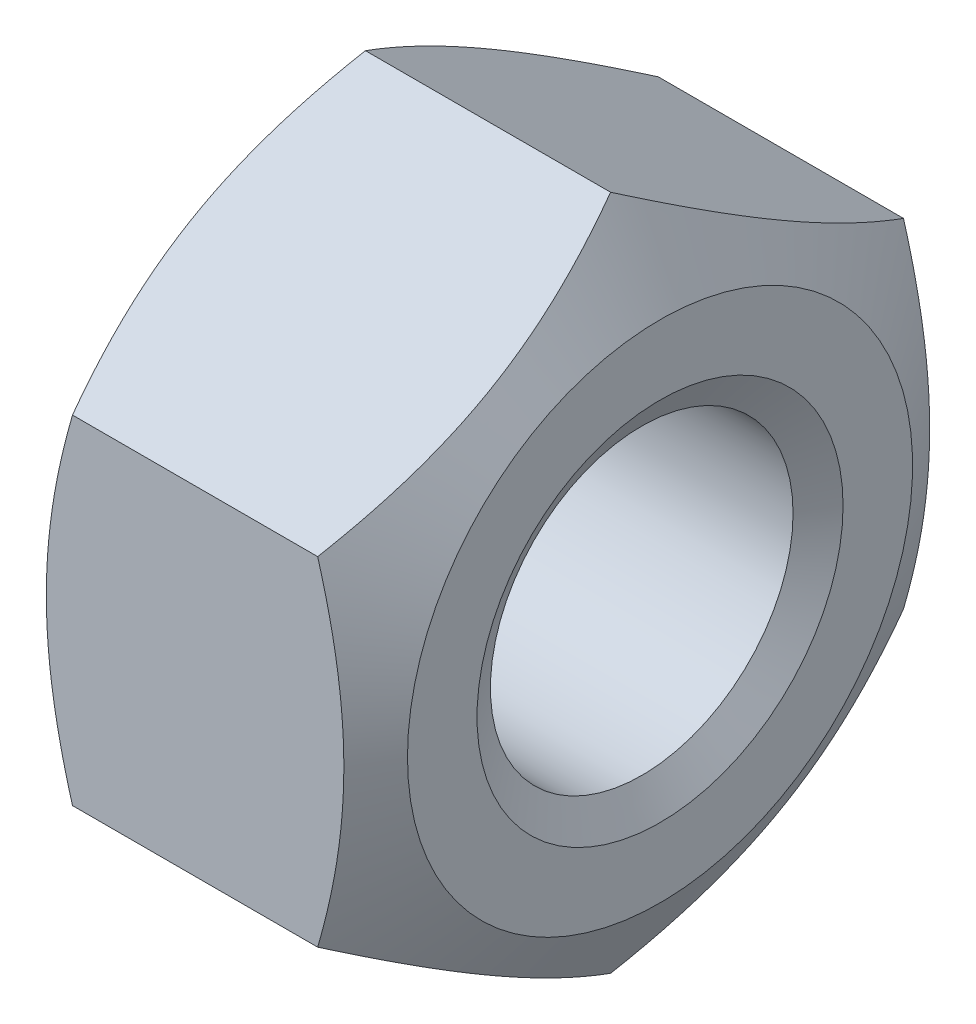
ISO-10303-21;
HEADER;
FILE_DESCRIPTION(('STEP AP214'),'2;1');
FILE_NAME('part.step','',(''),(''),'','','');
FILE_SCHEMA(('AUTOMOTIVE_DESIGN { 1 0 10303 214 1 1 1 1 }'));
ENDSEC;
DATA;
#1=APPLICATION_CONTEXT('core data for automotive mechanical design processes');
#2=APPLICATION_PROTOCOL_DEFINITION('international standard','automotive_design',2000,#1);
#3=PRODUCT_CONTEXT('',#1,'mechanical');
#4=PRODUCT('Part','Part','',(#3));
#5=PRODUCT_RELATED_PRODUCT_CATEGORY('part','',(#4));
#6=PRODUCT_DEFINITION_FORMATION('','',#4);
#7=PRODUCT_DEFINITION_CONTEXT('part definition',#1,'design');
#8=PRODUCT_DEFINITION('design','',#6,#7);
#9=PRODUCT_DEFINITION_SHAPE('','',#8);
#10=(LENGTH_UNIT() NAMED_UNIT(*) SI_UNIT(.MILLI.,.METRE.));
#11=(NAMED_UNIT(*) PLANE_ANGLE_UNIT() SI_UNIT($,.RADIAN.));
#12=(NAMED_UNIT(*) SI_UNIT($,.STERADIAN.) SOLID_ANGLE_UNIT());
#13=UNCERTAINTY_MEASURE_WITH_UNIT(LENGTH_MEASURE(1.E-05),#10,'distance_accuracy_value','');
#14=(GEOMETRIC_REPRESENTATION_CONTEXT(3) GLOBAL_UNCERTAINTY_ASSIGNED_CONTEXT((#13)) GLOBAL_UNIT_ASSIGNED_CONTEXT((#10,
#11,#12)) REPRESENTATION_CONTEXT('',''));
#15=CARTESIAN_POINT('',(0.,0.,0.));
#16=DIRECTION('',(0.,0.,1.));
#17=DIRECTION('',(1.,0.,0.));
#18=AXIS2_PLACEMENT_3D('',#15,#16,#17);
#19=CARTESIAN_POINT('',(0.,0.,-2.75849364905392));
#20=DIRECTION('',(-1.,0.,0.));
#21=DIRECTION('',(0.,0.,1.));
#22=AXIS2_PLACEMENT_3D('',#19,#20,#21);
#23=PLANE('',#22);
#24=CARTESIAN_POINT('',(-3.41060513164848E-10,0.,0.));
#25=DIRECTION('',(-1.,0.,0.));
#26=DIRECTION('',(0.,0.,1.));
#27=AXIS2_PLACEMENT_3D('',#24,#25,#26);
#28=CIRCLE('',#27,2.49999999988404);
#29=CARTESIAN_POINT('',(-3.41060513164848E-10,0.,2.49999999988404));
#30=VERTEX_POINT('',#29);
#31=EDGE_CURVE('E79',#30,#30,#28,.F.);
#32=ORIENTED_EDGE('',*,*,#31,.T.);
#33=EDGE_LOOP('',(#32));
#34=FACE_BOUND('',#33,.T.);
#35=CARTESIAN_POINT('',(-6.97352332129642E-10,0.,0.));
#36=DIRECTION('',(1.,0.,0.));
#37=DIRECTION('',(0.,0.,-1.));
#38=AXIS2_PLACEMENT_3D('',#35,#36,#37);
#39=CIRCLE('',#38,3.45000000044138);
#40=CARTESIAN_POINT('',(-6.97352332129642E-10,0.,-3.45000000044138));
#41=VERTEX_POINT('',#40);
#42=EDGE_CURVE('E20',#41,#41,#39,.T.);
#43=ORIENTED_EDGE('',*,*,#42,.F.);
#44=EDGE_LOOP('',(#43));
#45=FACE_BOUND('',#44,.T.);
#46=ADVANCED_FACE('F16',(#34,#45),#23,.T.);
#47=CARTESIAN_POINT('',(0.679552814517592,0.,0.));
#48=DIRECTION('',(1.,0.,0.));
#49=DIRECTION('',(0.,0.,-1.));
#50=AXIS2_PLACEMENT_3D('',#47,#48,#49);
#51=CONICAL_SURFACE('',#50,4.62701999953197,1.04719754998692);
#52=ORIENTED_EDGE('',*,*,#42,.T.);
#53=EDGE_LOOP('',(#52));
#54=FACE_BOUND('',#53,.T.);
#55=CARTESIAN_POINT('',(0.675499815710433,2.31000000025916,-4.00103736538083));
#56=CARTESIAN_POINT('',(0.616875706146725,2.41151051032535,-3.82521600422248));
#57=CARTESIAN_POINT('',(0.563560146621134,2.51389725772735,-3.64787695560965));
#58=CARTESIAN_POINT('',(0.470499438739523,2.72044351063077,-3.29012835140134));
#59=CARTESIAN_POINT('',(0.43078720814123,2.82460668486491,-3.10971244137469));
#60=CARTESIAN_POINT('',(0.368972258175167,3.03164219131205,-2.75111642525491));
#61=CARTESIAN_POINT('',(0.346458078083783,3.13448267738203,-2.57299147830031));
#62=CARTESIAN_POINT('',(0.319585871845553,3.34064729553255,-2.21590388493598));
#63=CARTESIAN_POINT('',(0.315205587849632,3.44397067877492,-2.036942535552));
#64=CARTESIAN_POINT('',(0.324341348952271,3.63701933602665,-1.70257245286012));
#65=CARTESIAN_POINT('',(0.335614261895873,3.72677357856035,-1.54711354459654));
#66=CARTESIAN_POINT('',(0.371335554619645,3.90569734401183,-1.23720849215275));
#67=CARTESIAN_POINT('',(0.39579612478073,3.99486624854199,-1.08276341905135));
#68=CARTESIAN_POINT('',(0.456942815830252,4.17415861382502,-0.772219932972023));
#69=CARTESIAN_POINT('',(0.493888012613579,4.2642593941565,-0.616160803636287));
#70=CARTESIAN_POINT('',(0.57773799017851,4.44311749034872,-0.306369493686267));
#71=CARTESIAN_POINT('',(0.62462308219874,4.53187709582086,-0.152633347348727));
#72=CARTESIAN_POINT('',(0.675499815822788,4.61999999988917,-1.91943219803724E-10));
#73=B_SPLINE_CURVE_WITH_KNOTS('',3,(#55,#56,#57,#58,#59,#60,#61,#62,#63,#64,#65,#66,#67,#68,#69,
#70,#71,#72),.UNSPECIFIED.,.F.,.F.,(4,2,2,2,2,2,2,2,4),(0.,0.634196454095155,1.26991689116046,
1.88990521651873,2.50913233174619,3.04820588677867,3.58777860609177,4.13931646276886,
4.68977188345555),.UNSPECIFIED.);
#74=CARTESIAN_POINT('',(0.675499815850821,2.31000000006232,-4.00103736537621));
#75=VERTEX_POINT('',#74);
#76=CARTESIAN_POINT('',(0.675499815814856,4.61999999987543,0.));
#77=VERTEX_POINT('',#76);
#78=EDGE_CURVE('E68',#75,#77,#73,.T.);
#79=ORIENTED_EDGE('',*,*,#78,.F.);
#80=CARTESIAN_POINT('',(0.675499815710454,-2.30999999978107,-4.00103736565687));
#81=CARTESIAN_POINT('',(0.62075316939519,-2.1203719051847,-4.00103736554615));
#82=CARTESIAN_POINT('',(0.570631068233272,-1.92924368450064,-4.00103736550072));
#83=CARTESIAN_POINT('',(0.482046472147167,-1.54388249785274,-4.00103736546743));
#84=CARTESIAN_POINT('',(0.443610064879713,-1.34964358960926,-4.00103736547968));
#85=CARTESIAN_POINT('',(0.381799669813618,-0.963345307118692,-4.00103736548841));
#86=CARTESIAN_POINT('',(0.358096134832012,-0.771340320595413,-4.00103736548525));
#87=CARTESIAN_POINT('',(0.326275544827323,-0.386222601790189,-4.00103736548294));
#88=CARTESIAN_POINT('',(0.31814157123256,-0.193111300895138,-4.00103736548378));
#89=CARTESIAN_POINT('',(0.318141571232184,0.193111300897352,-4.0010373654844));
#90=CARTESIAN_POINT('',(0.326275544826757,0.386222601794791,-4.00103736548418));
#91=CARTESIAN_POINT('',(0.358096134833664,0.771340320603943,-4.00103736548401));
#92=CARTESIAN_POINT('',(0.381799669817668,0.963345307128763,-4.00103736548407));
#93=CARTESIAN_POINT('',(0.443610064879729,1.34964358962496,-4.00103736548412));
#94=CARTESIAN_POINT('',(0.482046472140547,1.54388249787258,-4.00103736548411));
#95=CARTESIAN_POINT('',(0.570631068248898,1.92924368452008,-4.00103736548408));
#96=CARTESIAN_POINT('',(0.620753169439652,2.12037190519961,-4.00103736548407));
#97=CARTESIAN_POINT('',(0.675499815823569,2.30999999978106,-4.00103736548409));
#98=B_SPLINE_CURVE_WITH_KNOTS('',3,(#80,#81,#82,#83,#84,#85,#86,#87,#88,#89,#90,#91,#92,#93,#94,
#95,#96,#97),.UNSPECIFIED.,.F.,.F.,(4,2,2,2,2,2,2,2,4),(0.,0.59230035994406,1.18591344875415,
1.76571952358744,2.34489519711522,2.92407087064964,3.50387694548921,4.09749003430624,
4.68979039425891),.UNSPECIFIED.);
#99=CARTESIAN_POINT('',(0.675499815814865,-2.30999999993776,-4.00103736537621));
#100=VERTEX_POINT('',#99);
#101=EDGE_CURVE('E73',#100,#75,#98,.T.);
#102=ORIENTED_EDGE('',*,*,#101,.F.);
#103=CARTESIAN_POINT('',(0.675499815710445,-4.62000000004013,-2.76035103759492E-10));
#104=CARTESIAN_POINT('',(0.616875706146733,-4.51848948978216,-0.175821361323655));
#105=CARTESIAN_POINT('',(0.563560146621139,-4.41610274230148,-0.353160409891068));
#106=CARTESIAN_POINT('',(0.470499438739526,-4.20955648934037,-0.710909014066076));
#107=CARTESIAN_POINT('',(0.430787208141234,-4.10539331512747,-0.891324924104989));
#108=CARTESIAN_POINT('',(0.368972258175172,-3.89835780869542,-1.24992094023348));
#109=CARTESIAN_POINT('',(0.346458078083788,-3.79551732261998,-1.42804588718493));
#110=CARTESIAN_POINT('',(0.31958587184556,-3.58935270446548,-1.78513348054696));
#111=CARTESIAN_POINT('',(0.315205587849639,-3.4860293212246,-1.9640948299318));
#112=CARTESIAN_POINT('',(0.324341348952278,-3.2929806639738,-2.29846491262422));
#113=CARTESIAN_POINT('',(0.33561426189588,-3.20322642143979,-2.45392382088762));
#114=CARTESIAN_POINT('',(0.371335554619653,-3.02430265598807,-2.76382887333127));
#115=CARTESIAN_POINT('',(0.395796124780738,-2.93513375145799,-2.91827394643272));
#116=CARTESIAN_POINT('',(0.456942815830259,-2.75584138617504,-3.22881743251208));
#117=CARTESIAN_POINT('',(0.493888012613586,-2.66574060584355,-3.3848765618478));
#118=CARTESIAN_POINT('',(0.577737990178517,-2.48688250965129,-3.6946678717978));
#119=CARTESIAN_POINT('',(0.624623082198747,-2.39812290417913,-3.84840401813533));
#120=CARTESIAN_POINT('',(0.675499815822794,-2.31000000011086,-4.00103736529213));
#121=B_SPLINE_CURVE_WITH_KNOTS('',3,(#103,#104,#105,#106,#107,#108,#109,#110,#111,#112,#113,
#114,#115,#116,#117,#118,#119,#120),.UNSPECIFIED.,.F.,.F.,(4,2,2,2,2,2,2,2,4),(0.,
0.634196454095157,1.26991689116047,1.88990521651874,2.5091323317462,3.04820588677867,
3.58777860609177,4.13931646276886,4.68977188345554),.UNSPECIFIED.);
#122=CARTESIAN_POINT('',(0.675499815814858,-4.61999999987543,0.));
#123=VERTEX_POINT('',#122);
#124=EDGE_CURVE('E92',#123,#100,#121,.T.);
#125=ORIENTED_EDGE('',*,*,#124,.F.);
#126=CARTESIAN_POINT('',(0.675499815710436,-2.31000000025915,4.00103736538083));
#127=CARTESIAN_POINT('',(0.616875706146727,-2.41151051032535,3.82521600422248));
#128=CARTESIAN_POINT('',(0.563560146621135,-2.51389725772735,3.64787695560965));
#129=CARTESIAN_POINT('',(0.470499438739523,-2.72044351063077,3.29012835140134));
#130=CARTESIAN_POINT('',(0.43078720814123,-2.82460668486491,3.10971244137469));
#131=CARTESIAN_POINT('',(0.368972258175167,-3.03164219131205,2.75111642525491));
#132=CARTESIAN_POINT('',(0.346458078083783,-3.13448267738203,2.57299147830031));
#133=CARTESIAN_POINT('',(0.319585871845553,-3.34064729553255,2.21590388493598));
#134=CARTESIAN_POINT('',(0.315205587849632,-3.44397067877492,2.036942535552));
#135=CARTESIAN_POINT('',(0.324341348952272,-3.63701933602665,1.70257245286012));
#136=CARTESIAN_POINT('',(0.335614261895873,-3.72677357856035,1.54711354459654));
#137=CARTESIAN_POINT('',(0.371335554619646,-3.90569734401183,1.23720849215275));
#138=CARTESIAN_POINT('',(0.395796124780731,-3.99486624854199,1.08276341905135));
#139=CARTESIAN_POINT('',(0.456942815830252,-4.17415861382502,0.772219932972022));
#140=CARTESIAN_POINT('',(0.493888012613579,-4.2642593941565,0.616160803636287));
#141=CARTESIAN_POINT('',(0.57773799017851,-4.44311749034872,0.306369493686267));
#142=CARTESIAN_POINT('',(0.62462308219874,-4.53187709582086,0.152633347348726));
#143=CARTESIAN_POINT('',(0.675499815822788,-4.61999999988917,1.91942638692315E-10));
#144=B_SPLINE_CURVE_WITH_KNOTS('',3,(#126,#127,#128,#129,#130,#131,#132,#133,#134,#135,#136,
#137,#138,#139,#140,#141,#142,#143),.UNSPECIFIED.,.F.,.F.,(4,2,2,2,2,2,2,2,4),(0.,
0.634196454095155,1.26991689116046,1.88990521651873,2.50913233174619,3.04820588677867,
3.58777860609177,4.13931646276886,4.68977188345555),.UNSPECIFIED.);
#145=CARTESIAN_POINT('',(0.675499815814861,-2.30999999993775,4.00103736537621));
#146=VERTEX_POINT('',#145);
#147=EDGE_CURVE('E129',#146,#123,#144,.T.);
#148=ORIENTED_EDGE('',*,*,#147,.F.);
#149=CARTESIAN_POINT('',(0.675499815710453,2.30999999978107,4.00103736565687));
#150=CARTESIAN_POINT('',(0.620753169395189,2.12037190518469,4.00103736554615));
#151=CARTESIAN_POINT('',(0.570631068233272,1.92924368450064,4.00103736550073));
#152=CARTESIAN_POINT('',(0.482046472147167,1.54388249785274,4.00103736546743));
#153=CARTESIAN_POINT('',(0.443610064879713,1.34964358960926,4.00103736547968));
#154=CARTESIAN_POINT('',(0.381799669813618,0.963345307118692,4.00103736548841));
#155=CARTESIAN_POINT('',(0.358096134832012,0.771340320595413,4.00103736548525));
#156=CARTESIAN_POINT('',(0.326275544827323,0.386222601790189,4.00103736548294));
#157=CARTESIAN_POINT('',(0.31814157123256,0.193111300895138,4.00103736548378));
#158=CARTESIAN_POINT('',(0.318141571232184,-0.193111300897352,4.0010373654844));
#159=CARTESIAN_POINT('',(0.326275544826757,-0.38622260179479,4.00103736548418));
#160=CARTESIAN_POINT('',(0.358096134833664,-0.771340320603941,4.00103736548401));
#161=CARTESIAN_POINT('',(0.381799669817668,-0.963345307128761,4.00103736548407));
#162=CARTESIAN_POINT('',(0.443610064879728,-1.34964358962496,4.00103736548412));
#163=CARTESIAN_POINT('',(0.482046472140546,-1.54388249787257,4.00103736548411));
#164=CARTESIAN_POINT('',(0.570631068248897,-1.92924368452007,4.00103736548408));
#165=CARTESIAN_POINT('',(0.620753169439651,-2.1203719051996,4.00103736548407));
#166=CARTESIAN_POINT('',(0.675499815823567,-2.30999999978106,4.00103736548409));
#167=B_SPLINE_CURVE_WITH_KNOTS('',3,(#149,#150,#151,#152,#153,#154,#155,#156,#157,#158,#159,
#160,#161,#162,#163,#164,#165,#166),.UNSPECIFIED.,.F.,.F.,(4,2,2,2,2,2,2,2,4),(0.,
0.59230035994406,1.18591344875415,1.76571952358744,2.34489519711522,2.92407087064964,
3.5038769454892,4.09749003430623,4.6897903942589),.UNSPECIFIED.);
#168=CARTESIAN_POINT('',(0.675499815814865,2.30999999993776,4.00103736537621));
#169=VERTEX_POINT('',#168);
#170=EDGE_CURVE('E135',#169,#146,#167,.T.);
#171=ORIENTED_EDGE('',*,*,#170,.F.);
#172=CARTESIAN_POINT('',(0.675499815710443,4.62000000004013,2.76034362323012E-10));
#173=CARTESIAN_POINT('',(0.616875706146731,4.51848948978215,0.175821361323654));
#174=CARTESIAN_POINT('',(0.563560146621137,4.41610274230148,0.353160409891066));
#175=CARTESIAN_POINT('',(0.470499438739524,4.20955648934037,0.710909014066074));
#176=CARTESIAN_POINT('',(0.430787208141232,4.10539331512747,0.891324924104987));
#177=CARTESIAN_POINT('',(0.368972258175171,3.89835780869542,1.24992094023348));
#178=CARTESIAN_POINT('',(0.346458078083787,3.79551732261998,1.42804588718492));
#179=CARTESIAN_POINT('',(0.319585871845558,3.58935270446548,1.78513348054696));
#180=CARTESIAN_POINT('',(0.315205587849637,3.4860293212246,1.9640948299318));
#181=CARTESIAN_POINT('',(0.324341348952277,3.2929806639738,2.29846491262422));
#182=CARTESIAN_POINT('',(0.335614261895879,3.20322642143979,2.45392382088762));
#183=CARTESIAN_POINT('',(0.371335554619652,3.02430265598807,2.76382887333127));
#184=CARTESIAN_POINT('',(0.395796124780738,2.93513375145799,2.91827394643272));
#185=CARTESIAN_POINT('',(0.456942815830259,2.75584138617503,3.22881743251208));
#186=CARTESIAN_POINT('',(0.493888012613586,2.66574060584355,3.38487656184781));
#187=CARTESIAN_POINT('',(0.577737990178517,2.48688250965129,3.6946678717978));
#188=CARTESIAN_POINT('',(0.624623082198746,2.39812290417913,3.84840401813533));
#189=CARTESIAN_POINT('',(0.675499815822794,2.31000000011086,4.00103736529214));
#190=B_SPLINE_CURVE_WITH_KNOTS('',3,(#172,#173,#174,#175,#176,#177,#178,#179,#180,#181,#182,
#183,#184,#185,#186,#187,#188,#189),.UNSPECIFIED.,.F.,.F.,(4,2,2,2,2,2,2,2,4),(0.,
0.634196454095156,1.26991689116046,1.88990521651874,2.50913233174619,3.04820588677867,
3.58777860609177,4.13931646276886,4.68977188345554),.UNSPECIFIED.);
#191=EDGE_CURVE('E75',#77,#169,#190,.T.);
#192=ORIENTED_EDGE('',*,*,#191,.F.);
#193=EDGE_LOOP('',(#79,#102,#125,#148,#171,#192));
#194=FACE_BOUND('',#193,.T.);
#195=ADVANCED_FACE('F70',(#54,#194),#51,.T.);
#196=CARTESIAN_POINT('',(-3.41060513164848E-10,0.,0.));
#197=DIRECTION('',(-1.,0.,0.));
#198=DIRECTION('',(0.,0.,1.));
#199=AXIS2_PLACEMENT_3D('',#196,#197,#198);
#200=CONICAL_SURFACE('',#199,2.49999999988404,1.04719754991082);
#201=CARTESIAN_POINT('',(0.249999999999965,0.,0.));
#202=DIRECTION('',(1.,0.,0.));
#203=DIRECTION('',(0.,0.,-1.));
#204=AXIS2_PLACEMENT_3D('',#201,#202,#203);
#205=CIRCLE('',#204,2.06698729810781);
#206=CARTESIAN_POINT('',(0.249999999999965,0.,-2.06698729810781));
#207=VERTEX_POINT('',#206);
#208=EDGE_CURVE('E88',#207,#207,#205,.T.);
#209=ORIENTED_EDGE('',*,*,#208,.T.);
#210=EDGE_LOOP('',(#209));
#211=FACE_BOUND('',#210,.T.);
#212=ORIENTED_EDGE('',*,*,#31,.F.);
#213=EDGE_LOOP('',(#212));
#214=FACE_BOUND('',#213,.T.);
#215=ADVANCED_FACE('F118',(#211,#214),#200,.F.);
#216=CARTESIAN_POINT('',(0.,4.61999999999999,0.));
#217=DIRECTION('',(0.,0.866025403784441,-0.499999999999996));
#218=DIRECTION('',(0.,0.499999999999996,0.866025403784441));
#219=AXIS2_PLACEMENT_3D('',#216,#217,#218);
#220=PLANE('',#219);
#221=ORIENTED_EDGE('',*,*,#78,.T.);
#222=DIRECTION('',(1.,0.,0.));
#223=VECTOR('',#222,1.);
#224=CARTESIAN_POINT('',(0.,4.61999999999998,0.));
#225=LINE('',#224,#223);
#226=CARTESIAN_POINT('',(4.02450017934991,4.62000000826325,-1.43123807407851E-08));
#227=VERTEX_POINT('',#226);
#228=EDGE_CURVE('E78',#227,#77,#225,.F.);
#229=ORIENTED_EDGE('',*,*,#228,.F.);
#230=CARTESIAN_POINT('',(4.02450015201268,2.30999995439041,-4.00103736981796));
#231=CARTESIAN_POINT('',(4.08312427759664,2.41151048469421,-3.82521602167674));
#232=CARTESIAN_POINT('',(4.13643984444339,2.51389724119439,-3.64787697702516));
#233=CARTESIAN_POINT('',(4.22950055905261,2.7204435023942,-3.29012837290527));
#234=CARTESIAN_POINT('',(4.26921278905364,2.82460667580128,-3.1097124589894));
#235=CARTESIAN_POINT('',(4.33102773949272,3.03164218313104,-2.75111643755619));
#236=CARTESIAN_POINT('',(4.3535419206401,3.13448267084183,-2.57299148913014));
#237=CARTESIAN_POINT('',(4.38041412808755,3.34064729166287,-2.21590389213598));
#238=CARTESIAN_POINT('',(4.38479441222915,3.44397067593604,-2.03694254059385));
#239=CARTESIAN_POINT('',(4.3756586513622,3.63701933070374,-1.70257246197107));
#240=CARTESIAN_POINT('',(4.36438573925884,3.72677356970889,-1.54711355989844));
#241=CARTESIAN_POINT('',(4.32866444918594,3.90569732809687,-1.23720851974757));
#242=CARTESIAN_POINT('',(4.30420388084213,3.9948662290924,-1.08276345274748));
#243=CARTESIAN_POINT('',(4.24305719424437,4.1741585873624,-0.772219978797989));
#244=CARTESIAN_POINT('',(4.20611200011013,4.26425936421776,-0.616160855487392));
#245=CARTESIAN_POINT('',(4.12226202836179,4.44311745362684,-0.306369557294741));
#246=CARTESIAN_POINT('',(4.07537693950107,4.53187705579095,-0.152633416691168));
#247=CARTESIAN_POINT('',(4.02450020918221,4.61999995659219,-7.51845098470854E-08));
#248=B_SPLINE_CURVE_WITH_KNOTS('',3,(#230,#231,#232,#233,#234,#235,#236,#237,#238,#239,#240,
#241,#242,#243,#244,#245,#246,#247),.UNSPECIFIED.,.F.,.F.,(4,2,2,2,2,2,2,2,4),(0.,
0.634196462816231,1.26991690791921,1.8899052400348,2.50913236230783,3.04820589593565,
3.58777859358905,4.13931642825354,4.6897718273519),.UNSPECIFIED.);
#249=CARTESIAN_POINT('',(4.02450017934732,2.30999999173231,-4.00103737980422));
#250=VERTEX_POINT('',#249);
#251=EDGE_CURVE('E86',#250,#227,#248,.T.);
#252=ORIENTED_EDGE('',*,*,#251,.F.);
#253=DIRECTION('',(-1.,0.,0.));
#254=VECTOR('',#253,1.);
#255=CARTESIAN_POINT('',(0.,2.31000000000006,-4.00103736548409));
#256=LINE('',#255,#254);
#257=EDGE_CURVE('E83',#75,#250,#256,.F.);
#258=ORIENTED_EDGE('',*,*,#257,.F.);
#259=EDGE_LOOP('',(#221,#229,#252,#258));
#260=FACE_BOUND('',#259,.T.);
#261=ADVANCED_FACE('F84',(#260),#220,.T.);
#262=CARTESIAN_POINT('',(0.,2.31000000000003,4.00103736548409));
#263=DIRECTION('',(0.,0.866025403784441,0.499999999999995));
#264=DIRECTION('',(0.,-0.499999999999995,0.866025403784441));
#265=AXIS2_PLACEMENT_3D('',#262,#263,#264);
#266=PLANE('',#265);
#267=ORIENTED_EDGE('',*,*,#191,.T.);
#268=DIRECTION('',(1.,0.,0.));
#269=VECTOR('',#268,1.);
#270=CARTESIAN_POINT('',(0.,2.31000000000001,4.00103736548409));
#271=LINE('',#270,#269);
#272=CARTESIAN_POINT('',(4.02450017935005,2.31000001652604,4.00103736548409));
#273=VERTEX_POINT('',#272);
#274=EDGE_CURVE('E141',#273,#169,#271,.F.);
#275=ORIENTED_EDGE('',*,*,#274,.F.);
#276=CARTESIAN_POINT('',(4.02450015202121,4.61999998094482,-4.16485940374586E-08));
#277=CARTESIAN_POINT('',(4.08312427760248,4.51848949207572,0.17582133041491));
#278=CARTESIAN_POINT('',(4.13643984444782,4.4161027525736,0.353160384879877));
#279=CARTESIAN_POINT('',(4.22950055905536,4.20955650383687,0.710908996194096));
#280=CARTESIAN_POINT('',(4.26921278905613,4.10539332584297,0.891324907460979));
#281=CARTESIAN_POINT('',(4.33102773949444,3.89835781525151,1.24992092700964));
#282=CARTESIAN_POINT('',(4.35354192064132,3.79551732872234,1.42804587611727));
#283=CARTESIAN_POINT('',(4.38041412808793,3.58935270876009,1.78513347360592));
#284=CARTESIAN_POINT('',(4.38479441222919,3.48602932416593,1.96409482496202));
#285=CARTESIAN_POINT('',(4.3756586513617,3.29298066919777,2.29846490346745));
#286=CARTESIAN_POINT('',(4.36438573925814,3.20322643026139,2.45392380557889));
#287=CARTESIAN_POINT('',(4.32866444918498,3.02430267192466,2.76382884575757));
#288=CARTESIAN_POINT('',(4.30420388084112,2.93513377091155,2.91827391274662));
#289=CARTESIAN_POINT('',(4.24305719424336,2.75584141262763,3.22881738668621));
#290=CARTESIAN_POINT('',(4.20611200010919,2.66574063577642,3.38487650999824));
#291=CARTESIAN_POINT('',(4.12226202836111,2.4868825463756,3.69466780819374));
#292=CARTESIAN_POINT('',(4.07537693950056,2.3981229442156,3.84840394879874));
#293=CARTESIAN_POINT('',(4.02450020918192,2.31000004340735,4.00103729030041));
#294=B_SPLINE_CURVE_WITH_KNOTS('',3,(#276,#277,#278,#279,#280,#281,#282,#283,#284,#285,#286,
#287,#288,#289,#290,#291,#292,#293),.UNSPECIFIED.,.F.,.F.,(4,2,2,2,2,2,2,2,4),(0.,
0.63419646281405,1.26991690791493,1.8899052400287,2.5091323622999,3.04820589592544,
3.58777859357658,4.13931642823857,4.68977182733441),.UNSPECIFIED.);
#295=EDGE_CURVE('E163',#227,#273,#294,.T.);
#296=ORIENTED_EDGE('',*,*,#295,.F.);
#297=ORIENTED_EDGE('',*,*,#228,.T.);
#298=EDGE_LOOP('',(#267,#275,#296,#297));
#299=FACE_BOUND('',#298,.T.);
#300=ADVANCED_FACE('F150',(#299),#266,.T.);
#301=CARTESIAN_POINT('',(0.,-2.31000000000003,4.00103736548409));
#302=DIRECTION('',(0.,0.,1.));
#303=DIRECTION('',(1.,0.,0.));
#304=AXIS2_PLACEMENT_3D('',#301,#302,#303);
#305=PLANE('',#304);
#306=DIRECTION('',(1.,0.,0.));
#307=VECTOR('',#306,1.);
#308=CARTESIAN_POINT('',(0.,-2.31000000000005,4.00103736548404));
#309=LINE('',#308,#307);
#310=CARTESIAN_POINT('',(4.02450017934516,-2.30999999172853,4.00103737981073));
#311=VERTEX_POINT('',#310);
#312=EDGE_CURVE('E140',#311,#146,#309,.F.);
#313=ORIENTED_EDGE('',*,*,#312,.F.);
#314=CARTESIAN_POINT('',(4.02450015202169,2.31000002654022,4.00103732815785));
#315=CARTESIAN_POINT('',(4.07924681438304,2.12037193285964,4.0010373520765));
#316=CARTESIAN_POINT('',(4.12936892288524,1.92924371080052,4.00103736189029));
#317=CARTESIAN_POINT('',(4.21795352572459,1.54388251953613,4.00103736908587));
#318=CARTESIAN_POINT('',(4.25638993240047,1.34964360804959,4.00103736644006));
#319=CARTESIAN_POINT('',(4.31820032792585,0.963345319926019,4.00103736455036));
#320=CARTESIAN_POINT('',(4.34190386394316,0.771340331006461,4.00103736522878));
#321=CARTESIAN_POINT('',(4.37372445511068,0.386222607126021,4.00103736573914));
#322=CARTESIAN_POINT('',(4.38185842882601,0.193111303551603,4.001037365572));
#323=CARTESIAN_POINT('',(4.38185842874852,-0.193111293482322,4.00103736543831));
#324=CARTESIAN_POINT('',(4.37372445580395,-0.386222586941829,4.00103736547175));
#325=CARTESIAN_POINT('',(4.34190386823067,-0.771340290935095,4.00103736549645));
#326=CARTESIAN_POINT('',(4.31820033503908,-0.963345270082777,4.00103736548766));
#327=CARTESIAN_POINT('',(4.25638994450211,-1.34964353794973,4.00103736548044));
#328=CARTESIAN_POINT('',(4.21795353999047,-1.54388243894987,4.00103736548227));
#329=CARTESIAN_POINT('',(4.12936894996501,-1.92924361149794,4.00103736548591));
#330=CARTESIAN_POINT('',(4.0792468520973,-2.12037182532288,4.00103736548773));
#331=CARTESIAN_POINT('',(4.02450020919045,-2.30999991315586,4.00103736548409));
#332=B_SPLINE_CURVE_WITH_KNOTS('',3,(#314,#315,#316,#317,#318,#319,#320,#321,#322,#323,#324,
#325,#326,#327,#328,#329,#330,#331),.UNSPECIFIED.,.F.,.F.,(4,2,2,2,2,2,2,2,4),(0.,
0.592300369465157,1.18591346716546,1.76571954966568,2.34489523113308,2.92407088240088,
3.50387693466782,4.09749000058756,4.68979033816147),.UNSPECIFIED.);
#333=EDGE_CURVE('E156',#273,#311,#332,.T.);
#334=ORIENTED_EDGE('',*,*,#333,.F.);
#335=ORIENTED_EDGE('',*,*,#274,.T.);
#336=ORIENTED_EDGE('',*,*,#170,.T.);
#337=EDGE_LOOP('',(#313,#334,#335,#336));
#338=FACE_BOUND('',#337,.T.);
#339=ADVANCED_FACE('F146',(#338),#305,.T.);
#340=CARTESIAN_POINT('',(0.,-4.61999999999999,0.));
#341=DIRECTION('',(0.,-0.866025403784441,0.499999999999996));
#342=DIRECTION('',(0.,-0.499999999999996,-0.866025403784441));
#343=AXIS2_PLACEMENT_3D('',#340,#341,#342);
#344=PLANE('',#343);
#345=ORIENTED_EDGE('',*,*,#147,.T.);
#346=DIRECTION('',(1.,0.,0.));
#347=VECTOR('',#346,1.);
#348=CARTESIAN_POINT('',(0.,-4.61999999999998,0.));
#349=LINE('',#348,#347);
#350=CARTESIAN_POINT('',(4.02450017934497,-4.6200000082718,1.43271823051004E-08));
#351=VERTEX_POINT('',#350);
#352=EDGE_CURVE('E219',#351,#123,#349,.F.);
#353=ORIENTED_EDGE('',*,*,#352,.F.);
#354=CARTESIAN_POINT('',(4.02450015200547,-2.30999995437919,4.00103736982795));
#355=CARTESIAN_POINT('',(4.0831242775917,-2.41151048468563,3.82521602168821));
#356=CARTESIAN_POINT('',(4.13643984443966,-2.51389724118705,3.64787697703696));
#357=CARTESIAN_POINT('',(4.22950055905029,-2.7204435023881,3.29012837291674));
#358=CARTESIAN_POINT('',(4.26921278905154,-2.82460667579519,3.1097124590002));
#359=CARTESIAN_POINT('',(4.33102773949126,-3.03164218312525,2.75111643756598));
#360=CARTESIAN_POINT('',(4.35354192063906,-3.13448267083635,2.57299148913958));
#361=CARTESIAN_POINT('',(4.38041412808723,-3.34064729165792,2.21590389214461));
#362=CARTESIAN_POINT('',(4.38479441222911,-3.44397067593133,2.03694254060202));
#363=CARTESIAN_POINT('',(4.3756586513626,-3.63701933070016,1.70257246197726));
#364=CARTESIAN_POINT('',(4.36438573925929,-3.7267735697062,1.54711355990309));
#365=CARTESIAN_POINT('',(4.32866444918622,-3.90569732809595,1.23720851974917));
#366=CARTESIAN_POINT('',(4.30420388084219,-3.99486622909236,1.08276345274756));
#367=CARTESIAN_POINT('',(4.24305719424374,-4.17415858736415,0.772219978794962));
#368=CARTESIAN_POINT('',(4.20611200010902,-4.26425936422042,0.616160855482779));
#369=CARTESIAN_POINT('',(4.12226202835956,-4.44311745363131,0.306369557287001));
#370=CARTESIAN_POINT('',(4.07537693949818,-4.53187705579631,0.152633416681887));
#371=CARTESIAN_POINT('',(4.02450020917861,-4.61999995659842,7.51737099908132E-08));
#372=B_SPLINE_CURVE_WITH_KNOTS('',3,(#354,#355,#356,#357,#358,#359,#360,#361,#362,#363,#364,
#365,#366,#367,#368,#369,#370,#371),.UNSPECIFIED.,.F.,.F.,(4,2,2,2,2,2,2,2,4),(0.,
0.634196462818088,1.26991690792286,1.88990524003996,2.50913236231454,3.04820589594764,
3.58777859360632,4.13931642827647,4.68977182738048),.UNSPECIFIED.);
#373=EDGE_CURVE('E162',#311,#351,#372,.T.);
#374=ORIENTED_EDGE('',*,*,#373,.F.);
#375=ORIENTED_EDGE('',*,*,#312,.T.);
#376=EDGE_LOOP('',(#345,#353,#374,#375));
#377=FACE_BOUND('',#376,.T.);
#378=ADVANCED_FACE('F149',(#377),#344,.T.);
#379=CARTESIAN_POINT('',(0.,-2.31000000000003,-4.00103736548409));
#380=DIRECTION('',(0.,-0.866025403784441,-0.499999999999996));
#381=DIRECTION('',(0.,0.499999999999996,-0.866025403784441));
#382=AXIS2_PLACEMENT_3D('',#379,#380,#381);
#383=PLANE('',#382);
#384=ORIENTED_EDGE('',*,*,#124,.T.);
#385=DIRECTION('',(-1.,0.,0.));
#386=VECTOR('',#385,1.);
#387=CARTESIAN_POINT('',(0.,-2.31000000000006,-4.00103736548409));
#388=LINE('',#387,#386);
#389=CARTESIAN_POINT('',(4.02450017934997,-2.31000001652631,-4.00103736548409));
#390=VERTEX_POINT('',#389);
#391=EDGE_CURVE('E35',#390,#100,#388,.T.);
#392=ORIENTED_EDGE('',*,*,#391,.F.);
#393=CARTESIAN_POINT('',(4.02450015201827,-4.61999998097284,4.16741985040657E-08));
#394=CARTESIAN_POINT('',(4.08312427759569,-4.51848949209684,-0.175821330386565));
#395=CARTESIAN_POINT('',(4.1364398444399,-4.41610275259192,-0.353160384850362));
#396=CARTESIAN_POINT('',(4.22950055904769,-4.20955650385313,-0.710908996163724));
#397=CARTESIAN_POINT('',(4.26921278904984,-4.10539332585998,-0.891324907430925));
#398=CARTESIAN_POINT('',(4.33102773949039,-3.89835781526899,-1.24992092697994));
#399=CARTESIAN_POINT('',(4.35354192063814,-3.79551732873955,-1.42804587608762));
#400=CARTESIAN_POINT('',(4.38041412808666,-3.58935270877699,-1.78513347357651));
#401=CARTESIAN_POINT('',(4.38479441222898,-3.48602932418278,-1.96409482493279));
#402=CARTESIAN_POINT('',(4.3756586513633,-3.29298066921317,-2.2984649034408));
#403=CARTESIAN_POINT('',(4.36438573926031,-3.2032264302754,-2.45392380555463));
#404=CARTESIAN_POINT('',(4.32866444918785,-3.0243026719359,-2.7638288457381));
#405=CARTESIAN_POINT('',(4.3042038808441,-2.9351337709214,-2.91827391272956));
#406=CARTESIAN_POINT('',(4.24305719424615,-2.75584141263468,-3.22881738667399));
#407=CARTESIAN_POINT('',(4.20611200011167,-2.66574063578207,-3.38487650998844));
#408=CARTESIAN_POINT('',(4.12226202836264,-2.4868825463785,-3.6946678081887));
#409=CARTESIAN_POINT('',(4.07537693950146,-2.39812294421716,-3.84840394879603));
#410=CARTESIAN_POINT('',(4.02450020918206,-2.31000004340759,-4.0010372903));
#411=B_SPLINE_CURVE_WITH_KNOTS('',3,(#393,#394,#395,#396,#397,#398,#399,#400,#401,#402,#403,
#404,#405,#406,#407,#408,#409,#410),.UNSPECIFIED.,.F.,.F.,(4,2,2,2,2,2,2,2,4),(0.,
0.63419646281435,1.26991690791581,1.88990524003034,2.50913236230219,3.04820589593584,
3.58777859359518,4.13931642826558,4.68977182736969),.UNSPECIFIED.);
#412=EDGE_CURVE('E188',#351,#390,#411,.T.);
#413=ORIENTED_EDGE('',*,*,#412,.F.);
#414=ORIENTED_EDGE('',*,*,#352,.T.);
#415=EDGE_LOOP('',(#384,#392,#413,#414));
#416=FACE_BOUND('',#415,.T.);
#417=ADVANCED_FACE('F193',(#416),#383,.T.);
#418=CARTESIAN_POINT('',(0.,2.31000000000003,-4.00103736548409));
#419=DIRECTION('',(0.,0.,-1.));
#420=DIRECTION('',(-1.,0.,0.));
#421=AXIS2_PLACEMENT_3D('',#418,#419,#420);
#422=PLANE('',#421);
#423=ORIENTED_EDGE('',*,*,#257,.T.);
#424=CARTESIAN_POINT('',(4.02450015202145,-2.3100000265407,-4.00103732815769));
#425=CARTESIAN_POINT('',(4.07924681438395,-2.12037193285975,-4.00103735207811));
#426=CARTESIAN_POINT('',(4.12936892288581,-1.92924371080021,-4.00103736189111));
#427=CARTESIAN_POINT('',(4.21795352572422,-1.54388251953559,-4.00103736908504));
#428=CARTESIAN_POINT('',(4.25638993239956,-1.34964360804923,-4.00103736643839));
#429=CARTESIAN_POINT('',(4.31820032792686,-0.963345319925588,-4.001037364552));
#430=CARTESIAN_POINT('',(4.34190386394654,-0.771340331005762,-4.00103736523446));
#431=CARTESIAN_POINT('',(4.37372445510752,-0.386222607124206,-4.00103736573346));
#432=CARTESIAN_POINT('',(4.38185842881395,-0.193111303548938,-4.00103736555094));
#433=CARTESIAN_POINT('',(4.38185842873626,0.193111293487272,-4.00103736541725));
#434=CARTESIAN_POINT('',(4.37372445580035,0.386222586948215,-4.00103736546607));
#435=CARTESIAN_POINT('',(4.34190386823303,0.771340290943747,-4.00103736550213));
#436=CARTESIAN_POINT('',(4.31820033503876,0.96334527009226,-4.0010373654893));
#437=CARTESIAN_POINT('',(4.25638994449917,1.34964353796041,-4.00103736547876));
#438=CARTESIAN_POINT('',(4.21795353998768,1.54388243896093,-4.00103736548143));
#439=CARTESIAN_POINT('',(4.1293689499624,1.92924361151033,-4.00103736548675));
#440=CARTESIAN_POINT('',(4.07924685209466,2.12037182533624,-4.0010373654894));
#441=CARTESIAN_POINT('',(4.02450020918633,2.30999991317013,-4.00103736548409));
#442=B_SPLINE_CURVE_WITH_KNOTS('',3,(#424,#425,#426,#427,#428,#429,#430,#431,#432,#433,#434,
#435,#436,#437,#438,#439,#440,#441),.UNSPECIFIED.,.F.,.F.,(4,2,2,2,2,2,2,2,4),(0.,
0.592300369466434,1.18591346716611,1.76571954966731,2.3448952311366,2.92407088240808,
3.50387693467778,4.09749000059878,4.68979033817583),.UNSPECIFIED.);
#443=EDGE_CURVE('E183',#390,#250,#442,.T.);
#444=ORIENTED_EDGE('',*,*,#443,.F.);
#445=ORIENTED_EDGE('',*,*,#391,.T.);
#446=ORIENTED_EDGE('',*,*,#101,.T.);
#447=EDGE_LOOP('',(#423,#444,#445,#446));
#448=FACE_BOUND('',#447,.T.);
#449=ADVANCED_FACE('F90',(#448),#422,.T.);
#450=CARTESIAN_POINT('',(0.249999999999965,0.,0.));
#451=DIRECTION('',(1.,0.,0.));
#452=DIRECTION('',(0.,0.,-1.));
#453=AXIS2_PLACEMENT_3D('',#450,#451,#452);
#454=CYLINDRICAL_SURFACE('',#453,2.06698729810781);
#455=CARTESIAN_POINT('',(4.44999999979245,0.,0.));
#456=DIRECTION('',(1.,0.,0.));
#457=DIRECTION('',(0.,0.,-1.));
#458=AXIS2_PLACEMENT_3D('',#455,#456,#457);
#459=CIRCLE('',#458,2.06698729829213);
#460=CARTESIAN_POINT('',(4.44999999979245,0.,-2.06698729829213));
#461=VERTEX_POINT('',#460);
#462=EDGE_CURVE('E213',#461,#461,#459,.T.);
#463=ORIENTED_EDGE('',*,*,#462,.T.);
#464=EDGE_LOOP('',(#463));
#465=FACE_BOUND('',#464,.T.);
#466=ORIENTED_EDGE('',*,*,#208,.F.);
#467=EDGE_LOOP('',(#466));
#468=FACE_BOUND('',#467,.T.);
#469=ADVANCED_FACE('F175',(#465,#468),#454,.F.);
#470=CARTESIAN_POINT('',(4.02044718532579,0.,0.));
#471=DIRECTION('',(-1.,0.,0.));
#472=DIRECTION('',(0.,0.,1.));
#473=AXIS2_PLACEMENT_3D('',#470,#471,#472);
#474=CONICAL_SURFACE('',#473,4.62701999981618,1.04719754998692);
#475=CARTESIAN_POINT('',(4.70000000070483,0.,0.));
#476=DIRECTION('',(-1.,0.,0.));
#477=DIRECTION('',(0.,0.,1.));
#478=AXIS2_PLACEMENT_3D('',#475,#476,#477);
#479=CIRCLE('',#478,3.45000000044138);
#480=CARTESIAN_POINT('',(4.70000000070483,0.,3.45000000044138));
#481=VERTEX_POINT('',#480);
#482=EDGE_CURVE('E26',#481,#481,#479,.F.);
#483=ORIENTED_EDGE('',*,*,#482,.F.);
#484=EDGE_LOOP('',(#483));
#485=FACE_BOUND('',#484,.T.);
#486=ORIENTED_EDGE('',*,*,#412,.T.);
#487=ORIENTED_EDGE('',*,*,#443,.T.);
#488=ORIENTED_EDGE('',*,*,#251,.T.);
#489=ORIENTED_EDGE('',*,*,#295,.T.);
#490=ORIENTED_EDGE('',*,*,#333,.T.);
#491=ORIENTED_EDGE('',*,*,#373,.T.);
#492=EDGE_LOOP('',(#486,#487,#488,#489,#490,#491));
#493=FACE_BOUND('',#492,.T.);
#494=ADVANCED_FACE('F171',(#485,#493),#474,.T.);
#495=CARTESIAN_POINT('',(4.7000000001276,0.,0.));
#496=DIRECTION('',(1.,0.,0.));
#497=DIRECTION('',(0.,0.,-1.));
#498=AXIS2_PLACEMENT_3D('',#495,#496,#497);
#499=CONICAL_SURFACE('',#498,2.49999999959982,1.04719755000519);
#500=CARTESIAN_POINT('',(4.70000000022606,0.,0.));
#501=DIRECTION('',(1.,0.,0.));
#502=DIRECTION('',(0.,0.,-1.));
#503=AXIS2_PLACEMENT_3D('',#500,#501,#502);
#504=CIRCLE('',#503,2.49999999977035);
#505=CARTESIAN_POINT('',(4.70000000022606,0.,-2.49999999977035));
#506=VERTEX_POINT('',#505);
#507=EDGE_CURVE('E11',#506,#506,#504,.F.);
#508=ORIENTED_EDGE('',*,*,#507,.F.);
#509=EDGE_LOOP('',(#508));
#510=FACE_BOUND('',#509,.T.);
#511=ORIENTED_EDGE('',*,*,#462,.F.);
#512=EDGE_LOOP('',(#511));
#513=FACE_BOUND('',#512,.T.);
#514=ADVANCED_FACE('F174',(#510,#513),#499,.F.);
#515=CARTESIAN_POINT('',(4.70000000000002,0.,-2.75849364905392));
#516=DIRECTION('',(1.,0.,0.));
#517=DIRECTION('',(0.,0.,-1.));
#518=AXIS2_PLACEMENT_3D('',#515,#516,#517);
#519=PLANE('',#518);
#520=ORIENTED_EDGE('',*,*,#507,.T.);
#521=EDGE_LOOP('',(#520));
#522=FACE_BOUND('',#521,.T.);
#523=ORIENTED_EDGE('',*,*,#482,.T.);
#524=EDGE_LOOP('',(#523));
#525=FACE_BOUND('',#524,.T.);
#526=ADVANCED_FACE('F18',(#522,#525),#519,.T.);
#527=CLOSED_SHELL('',(#46,#195,#215,#261,#300,#339,#378,#417,#449,#469,#494,#514,#526));
#528=MANIFOLD_SOLID_BREP('B1',#527);
#529=ADVANCED_BREP_SHAPE_REPRESENTATION('',(#18,#528),#14);
#530=SHAPE_DEFINITION_REPRESENTATION(#9,#529);
ENDSEC;
END-ISO-10303-21;
